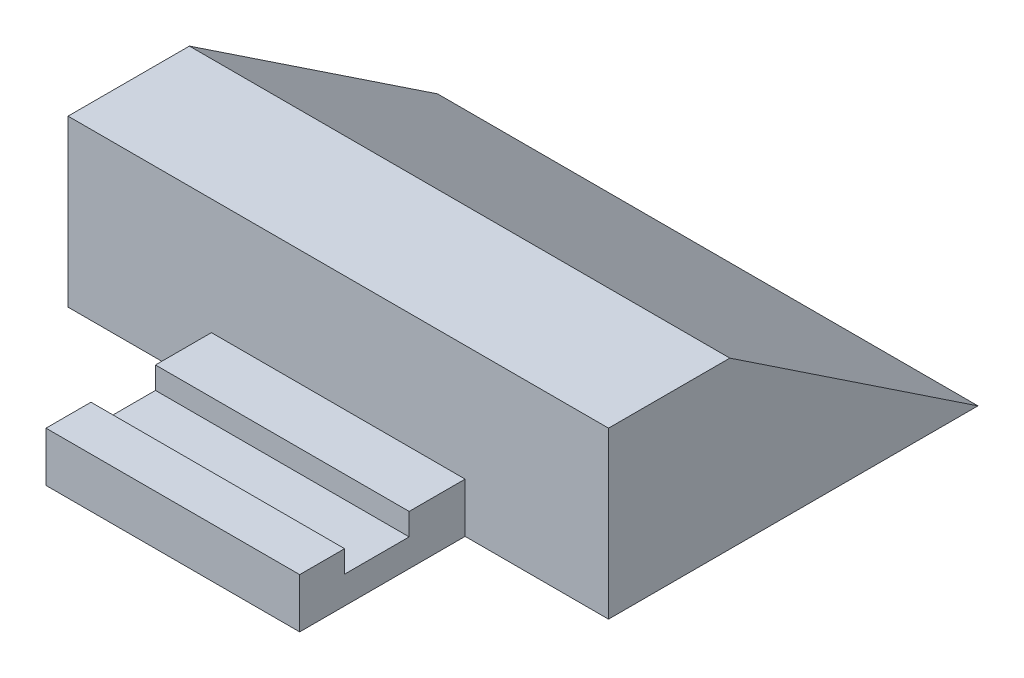
ISO-10303-21;
HEADER;
FILE_DESCRIPTION(('STEP AP214'),'2;1');
FILE_NAME('part.step','',(''),(''),'','','');
FILE_SCHEMA(('AUTOMOTIVE_DESIGN { 1 0 10303 214 1 1 1 1 }'));
ENDSEC;
DATA;
#1=APPLICATION_CONTEXT('core data for automotive mechanical design processes');
#2=APPLICATION_PROTOCOL_DEFINITION('international standard','automotive_design',2000,#1);
#3=PRODUCT_CONTEXT('',#1,'mechanical');
#4=PRODUCT('Part','Part','',(#3));
#5=PRODUCT_RELATED_PRODUCT_CATEGORY('part','',(#4));
#6=PRODUCT_DEFINITION_FORMATION('','',#4);
#7=PRODUCT_DEFINITION_CONTEXT('part definition',#1,'design');
#8=PRODUCT_DEFINITION('design','',#6,#7);
#9=PRODUCT_DEFINITION_SHAPE('','',#8);
#10=(LENGTH_UNIT() NAMED_UNIT(*) SI_UNIT(.MILLI.,.METRE.));
#11=(NAMED_UNIT(*) PLANE_ANGLE_UNIT() SI_UNIT($,.RADIAN.));
#12=(NAMED_UNIT(*) SI_UNIT($,.STERADIAN.) SOLID_ANGLE_UNIT());
#13=UNCERTAINTY_MEASURE_WITH_UNIT(LENGTH_MEASURE(1.E-05),#10,'distance_accuracy_value','');
#14=(GEOMETRIC_REPRESENTATION_CONTEXT(3) GLOBAL_UNCERTAINTY_ASSIGNED_CONTEXT((#13)) GLOBAL_UNIT_ASSIGNED_CONTEXT((#10,
#11,#12)) REPRESENTATION_CONTEXT('',''));
#15=CARTESIAN_POINT('',(0.,0.,0.));
#16=DIRECTION('',(0.,0.,1.));
#17=DIRECTION('',(1.,0.,0.));
#18=AXIS2_PLACEMENT_3D('',#15,#16,#17);
#19=CARTESIAN_POINT('',(49.,30.,-100.));
#20=DIRECTION('',(-1.,0.,0.));
#21=DIRECTION('',(0.,0.,1.));
#22=AXIS2_PLACEMENT_3D('',#19,#20,#21);
#23=PLANE('',#22);
#24=DIRECTION('',(0.,0.,-1.));
#25=VECTOR('',#24,1.);
#26=CARTESIAN_POINT('',(49.,0.,-100.));
#27=LINE('',#26,#25);
#28=CARTESIAN_POINT('',(49.,0.,-32.));
#29=VERTEX_POINT('',#28);
#30=CARTESIAN_POINT('',(49.,0.,-99.));
#31=VERTEX_POINT('',#30);
#32=EDGE_CURVE('E168',#29,#31,#27,.T.);
#33=ORIENTED_EDGE('',*,*,#32,.T.);
#34=DIRECTION('',(0.,-0.554700196225229,-0.832050294337844));
#35=VECTOR('',#34,1.);
#36=CARTESIAN_POINT('',(49.,0.,-99.));
#37=LINE('',#36,#35);
#38=CARTESIAN_POINT('',(49.,30.,-54.));
#39=VERTEX_POINT('',#38);
#40=EDGE_CURVE('E171',#39,#31,#37,.T.);
#41=ORIENTED_EDGE('',*,*,#40,.F.);
#42=DIRECTION('',(0.,0.,-1.));
#43=VECTOR('',#42,1.);
#44=CARTESIAN_POINT('',(49.,30.,-100.));
#45=LINE('',#44,#43);
#46=CARTESIAN_POINT('',(49.,30.,-32.));
#47=VERTEX_POINT('',#46);
#48=EDGE_CURVE('E156',#47,#39,#45,.T.);
#49=ORIENTED_EDGE('',*,*,#48,.F.);
#50=DIRECTION('',(0.,-1.,0.));
#51=VECTOR('',#50,1.);
#52=CARTESIAN_POINT('',(49.,30.,-32.));
#53=LINE('',#52,#51);
#54=EDGE_CURVE('E150',#47,#29,#53,.T.);
#55=ORIENTED_EDGE('',*,*,#54,.T.);
#56=EDGE_LOOP('',(#33,#41,#49,#55));
#57=FACE_BOUND('',#56,.T.);
#58=ADVANCED_FACE('F33',(#57),#23,.F.);
#59=CARTESIAN_POINT('',(-49.,30.,-100.));
#60=DIRECTION('',(1.,0.,0.));
#61=DIRECTION('',(0.,0.,-1.));
#62=AXIS2_PLACEMENT_3D('',#59,#60,#61);
#63=PLANE('',#62);
#64=DIRECTION('',(0.,0.,1.));
#65=VECTOR('',#64,1.);
#66=CARTESIAN_POINT('',(-49.,30.,-100.));
#67=LINE('',#66,#65);
#68=CARTESIAN_POINT('',(-49.,30.,-54.));
#69=VERTEX_POINT('',#68);
#70=CARTESIAN_POINT('',(-49.,30.,-32.));
#71=VERTEX_POINT('',#70);
#72=EDGE_CURVE('E173',#69,#71,#67,.T.);
#73=ORIENTED_EDGE('',*,*,#72,.F.);
#74=DIRECTION('',(0.,0.554700196225229,0.832050294337844));
#75=VECTOR('',#74,1.);
#76=CARTESIAN_POINT('',(-49.,0.,-99.));
#77=LINE('',#76,#75);
#78=CARTESIAN_POINT('',(-49.,0.,-99.));
#79=VERTEX_POINT('',#78);
#80=EDGE_CURVE('E181',#79,#69,#77,.T.);
#81=ORIENTED_EDGE('',*,*,#80,.F.);
#82=DIRECTION('',(0.,0.,1.));
#83=VECTOR('',#82,1.);
#84=CARTESIAN_POINT('',(-49.,0.,-100.));
#85=LINE('',#84,#83);
#86=CARTESIAN_POINT('',(-49.,0.,-32.));
#87=VERTEX_POINT('',#86);
#88=EDGE_CURVE('E166',#79,#87,#85,.T.);
#89=ORIENTED_EDGE('',*,*,#88,.T.);
#90=DIRECTION('',(0.,-1.,0.));
#91=VECTOR('',#90,1.);
#92=CARTESIAN_POINT('',(-49.,30.,-32.));
#93=LINE('',#92,#91);
#94=EDGE_CURVE('E40',#71,#87,#93,.T.);
#95=ORIENTED_EDGE('',*,*,#94,.F.);
#96=EDGE_LOOP('',(#73,#81,#89,#95));
#97=FACE_BOUND('',#96,.T.);
#98=ADVANCED_FACE('F245',(#97),#63,.F.);
#99=CARTESIAN_POINT('',(-23.,30.,-32.));
#100=DIRECTION('',(1.,0.,0.));
#101=DIRECTION('',(0.,0.,-1.));
#102=AXIS2_PLACEMENT_3D('',#99,#100,#101);
#103=PLANE('',#102);
#104=DIRECTION('',(0.,-1.,0.));
#105=VECTOR('',#104,1.);
#106=CARTESIAN_POINT('',(-23.,30.,-2.));
#107=LINE('',#106,#105);
#108=CARTESIAN_POINT('',(-23.,9.,-2.));
#109=VERTEX_POINT('',#108);
#110=CARTESIAN_POINT('',(-23.,0.,-2.));
#111=VERTEX_POINT('',#110);
#112=EDGE_CURVE('E142',#109,#111,#107,.T.);
#113=ORIENTED_EDGE('',*,*,#112,.F.);
#114=DIRECTION('',(0.,0.,1.));
#115=VECTOR('',#114,1.);
#116=CARTESIAN_POINT('',(-23.,9.,-32.));
#117=LINE('',#116,#115);
#118=CARTESIAN_POINT('',(-23.,9.,-10.15));
#119=VERTEX_POINT('',#118);
#120=EDGE_CURVE('E135',#119,#109,#117,.T.);
#121=ORIENTED_EDGE('',*,*,#120,.F.);
#122=DIRECTION('',(0.,1.,0.));
#123=VECTOR('',#122,1.);
#124=CARTESIAN_POINT('',(-23.,5.,-10.15));
#125=LINE('',#124,#123);
#126=CARTESIAN_POINT('',(-23.,5.,-10.15));
#127=VERTEX_POINT('',#126);
#128=EDGE_CURVE('E191',#127,#119,#125,.T.);
#129=ORIENTED_EDGE('',*,*,#128,.F.);
#130=DIRECTION('',(0.,0.,1.));
#131=VECTOR('',#130,1.);
#132=CARTESIAN_POINT('',(-23.,5.,-21.85));
#133=LINE('',#132,#131);
#134=CARTESIAN_POINT('',(-23.,5.,-21.85));
#135=VERTEX_POINT('',#134);
#136=EDGE_CURVE('E198',#135,#127,#133,.T.);
#137=ORIENTED_EDGE('',*,*,#136,.F.);
#138=DIRECTION('',(0.,1.,0.));
#139=VECTOR('',#138,1.);
#140=CARTESIAN_POINT('',(-23.,5.,-21.85));
#141=LINE('',#140,#139);
#142=CARTESIAN_POINT('',(-23.,9.,-21.85));
#143=VERTEX_POINT('',#142);
#144=EDGE_CURVE('E134',#135,#143,#141,.T.);
#145=ORIENTED_EDGE('',*,*,#144,.T.);
#146=CARTESIAN_POINT('',(-23.,9.,-32.));
#147=VERTEX_POINT('',#146);
#148=EDGE_CURVE('E55',#147,#143,#117,.T.);
#149=ORIENTED_EDGE('',*,*,#148,.F.);
#150=DIRECTION('',(0.,-1.,0.));
#151=VECTOR('',#150,1.);
#152=CARTESIAN_POINT('',(-23.,30.,-32.));
#153=LINE('',#152,#151);
#154=CARTESIAN_POINT('',(-23.,0.,-32.));
#155=VERTEX_POINT('',#154);
#156=EDGE_CURVE('E131',#147,#155,#153,.T.);
#157=ORIENTED_EDGE('',*,*,#156,.T.);
#158=DIRECTION('',(0.,0.,1.));
#159=VECTOR('',#158,1.);
#160=CARTESIAN_POINT('',(-23.,0.,-32.));
#161=LINE('',#160,#159);
#162=EDGE_CURVE('E163',#155,#111,#161,.T.);
#163=ORIENTED_EDGE('',*,*,#162,.T.);
#164=EDGE_LOOP('',(#113,#121,#129,#137,#145,#149,#157,#163));
#165=FACE_BOUND('',#164,.T.);
#166=ADVANCED_FACE('F129',(#165),#103,.F.);
#167=CARTESIAN_POINT('',(23.,30.,-2.));
#168=DIRECTION('',(0.,0.,-1.));
#169=DIRECTION('',(-1.,0.,0.));
#170=AXIS2_PLACEMENT_3D('',#167,#168,#169);
#171=PLANE('',#170);
#172=DIRECTION('',(0.,-1.,0.));
#173=VECTOR('',#172,1.);
#174=CARTESIAN_POINT('',(23.,30.,-2.));
#175=LINE('',#174,#173);
#176=CARTESIAN_POINT('',(23.,9.,-2.00000000000001));
#177=VERTEX_POINT('',#176);
#178=CARTESIAN_POINT('',(23.,0.,-2.));
#179=VERTEX_POINT('',#178);
#180=EDGE_CURVE('E144',#177,#179,#175,.T.);
#181=ORIENTED_EDGE('',*,*,#180,.F.);
#182=DIRECTION('',(-1.,0.,0.));
#183=VECTOR('',#182,1.);
#184=CARTESIAN_POINT('',(23.,9.,-2.));
#185=LINE('',#184,#183);
#186=EDGE_CURVE('E206',#177,#109,#185,.T.);
#187=ORIENTED_EDGE('',*,*,#186,.T.);
#188=ORIENTED_EDGE('',*,*,#112,.T.);
#189=DIRECTION('',(1.,0.,0.));
#190=VECTOR('',#189,1.);
#191=CARTESIAN_POINT('',(23.,0.,-2.));
#192=LINE('',#191,#190);
#193=EDGE_CURVE('E160',#111,#179,#192,.T.);
#194=ORIENTED_EDGE('',*,*,#193,.T.);
#195=EDGE_LOOP('',(#181,#187,#188,#194));
#196=FACE_BOUND('',#195,.T.);
#197=ADVANCED_FACE('F225',(#196),#171,.F.);
#198=CARTESIAN_POINT('',(23.,30.,-32.));
#199=DIRECTION('',(-1.,0.,0.));
#200=DIRECTION('',(0.,0.,1.));
#201=AXIS2_PLACEMENT_3D('',#198,#199,#200);
#202=PLANE('',#201);
#203=DIRECTION('',(0.,-1.,0.));
#204=VECTOR('',#203,1.);
#205=CARTESIAN_POINT('',(23.,30.,-32.));
#206=LINE('',#205,#204);
#207=CARTESIAN_POINT('',(23.,9.,-32.));
#208=VERTEX_POINT('',#207);
#209=CARTESIAN_POINT('',(23.,0.,-32.));
#210=VERTEX_POINT('',#209);
#211=EDGE_CURVE('E148',#208,#210,#206,.T.);
#212=ORIENTED_EDGE('',*,*,#211,.F.);
#213=DIRECTION('',(0.,0.,-1.));
#214=VECTOR('',#213,1.);
#215=CARTESIAN_POINT('',(23.,9.,-32.));
#216=LINE('',#215,#214);
#217=CARTESIAN_POINT('',(23.,9.,-21.85));
#218=VERTEX_POINT('',#217);
#219=EDGE_CURVE('E121',#218,#208,#216,.T.);
#220=ORIENTED_EDGE('',*,*,#219,.F.);
#221=DIRECTION('',(0.,1.,0.));
#222=VECTOR('',#221,1.);
#223=CARTESIAN_POINT('',(23.,5.,-21.85));
#224=LINE('',#223,#222);
#225=CARTESIAN_POINT('',(23.,5.,-21.85));
#226=VERTEX_POINT('',#225);
#227=EDGE_CURVE('E186',#226,#218,#224,.T.);
#228=ORIENTED_EDGE('',*,*,#227,.F.);
#229=DIRECTION('',(0.,0.,-1.));
#230=VECTOR('',#229,1.);
#231=CARTESIAN_POINT('',(23.,5.,-21.85));
#232=LINE('',#231,#230);
#233=CARTESIAN_POINT('',(23.,5.,-10.15));
#234=VERTEX_POINT('',#233);
#235=EDGE_CURVE('E203',#234,#226,#232,.T.);
#236=ORIENTED_EDGE('',*,*,#235,.F.);
#237=DIRECTION('',(0.,1.,0.));
#238=VECTOR('',#237,1.);
#239=CARTESIAN_POINT('',(23.,5.,-10.15));
#240=LINE('',#239,#238);
#241=CARTESIAN_POINT('',(23.,9.,-10.15));
#242=VERTEX_POINT('',#241);
#243=EDGE_CURVE('E185',#234,#242,#240,.T.);
#244=ORIENTED_EDGE('',*,*,#243,.T.);
#245=EDGE_CURVE('E47',#177,#242,#216,.T.);
#246=ORIENTED_EDGE('',*,*,#245,.F.);
#247=ORIENTED_EDGE('',*,*,#180,.T.);
#248=DIRECTION('',(0.,0.,-1.));
#249=VECTOR('',#248,1.);
#250=CARTESIAN_POINT('',(23.,0.,-32.));
#251=LINE('',#250,#249);
#252=EDGE_CURVE('E157',#179,#210,#251,.T.);
#253=ORIENTED_EDGE('',*,*,#252,.T.);
#254=EDGE_LOOP('',(#212,#220,#228,#236,#244,#246,#247,#253));
#255=FACE_BOUND('',#254,.T.);
#256=ADVANCED_FACE('F218',(#255),#202,.F.);
#257=CARTESIAN_POINT('',(49.,30.,-32.));
#258=DIRECTION('',(0.,0.,-1.));
#259=DIRECTION('',(-1.,0.,0.));
#260=AXIS2_PLACEMENT_3D('',#257,#258,#259);
#261=PLANE('',#260);
#262=DIRECTION('',(1.,0.,0.));
#263=VECTOR('',#262,1.);
#264=CARTESIAN_POINT('',(49.,0.,-32.));
#265=LINE('',#264,#263);
#266=EDGE_CURVE('E154',#210,#29,#265,.T.);
#267=ORIENTED_EDGE('',*,*,#266,.T.);
#268=ORIENTED_EDGE('',*,*,#54,.F.);
#269=DIRECTION('',(1.,0.,0.));
#270=VECTOR('',#269,1.);
#271=CARTESIAN_POINT('',(-49.,30.,-32.));
#272=LINE('',#271,#270);
#273=EDGE_CURVE('E153',#71,#47,#272,.T.);
#274=ORIENTED_EDGE('',*,*,#273,.F.);
#275=ORIENTED_EDGE('',*,*,#94,.T.);
#276=DIRECTION('',(1.,0.,0.));
#277=VECTOR('',#276,1.);
#278=CARTESIAN_POINT('',(-49.,0.,-32.));
#279=LINE('',#278,#277);
#280=EDGE_CURVE('E140',#87,#155,#279,.T.);
#281=ORIENTED_EDGE('',*,*,#280,.T.);
#282=ORIENTED_EDGE('',*,*,#156,.F.);
#283=DIRECTION('',(-1.,0.,0.));
#284=VECTOR('',#283,1.);
#285=CARTESIAN_POINT('',(63.2751921731186,9.,-32.));
#286=LINE('',#285,#284);
#287=EDGE_CURVE('E118',#208,#147,#286,.T.);
#288=ORIENTED_EDGE('',*,*,#287,.F.);
#289=ORIENTED_EDGE('',*,*,#211,.T.);
#290=EDGE_LOOP('',(#267,#268,#274,#275,#281,#282,#288,#289));
#291=FACE_BOUND('',#290,.T.);
#292=ADVANCED_FACE('F137',(#291),#261,.F.);
#293=CARTESIAN_POINT('',(0.,30.,0.));
#294=DIRECTION('',(0.,-1.,0.));
#295=DIRECTION('',(0.,0.,-1.));
#296=AXIS2_PLACEMENT_3D('',#293,#294,#295);
#297=PLANE('',#296);
#298=ORIENTED_EDGE('',*,*,#273,.T.);
#299=ORIENTED_EDGE('',*,*,#48,.T.);
#300=DIRECTION('',(-1.,0.,0.));
#301=VECTOR('',#300,1.);
#302=CARTESIAN_POINT('',(123.346958013474,30.,-54.));
#303=LINE('',#302,#301);
#304=EDGE_CURVE('E178',#39,#69,#303,.T.);
#305=ORIENTED_EDGE('',*,*,#304,.T.);
#306=ORIENTED_EDGE('',*,*,#72,.T.);
#307=EDGE_LOOP('',(#298,#299,#305,#306));
#308=FACE_BOUND('',#307,.T.);
#309=ADVANCED_FACE('F239',(#308),#297,.F.);
#310=CARTESIAN_POINT('',(0.,0.,0.));
#311=DIRECTION('',(0.,-1.,0.));
#312=DIRECTION('',(0.,0.,-1.));
#313=AXIS2_PLACEMENT_3D('',#310,#311,#312);
#314=PLANE('',#313);
#315=DIRECTION('',(-1.,0.,0.));
#316=VECTOR('',#315,1.);
#317=CARTESIAN_POINT('',(123.346958013474,0.,-99.));
#318=LINE('',#317,#316);
#319=EDGE_CURVE('E179',#31,#79,#318,.T.);
#320=ORIENTED_EDGE('',*,*,#319,.F.);
#321=ORIENTED_EDGE('',*,*,#32,.F.);
#322=ORIENTED_EDGE('',*,*,#266,.F.);
#323=ORIENTED_EDGE('',*,*,#252,.F.);
#324=ORIENTED_EDGE('',*,*,#193,.F.);
#325=ORIENTED_EDGE('',*,*,#162,.F.);
#326=ORIENTED_EDGE('',*,*,#280,.F.);
#327=ORIENTED_EDGE('',*,*,#88,.F.);
#328=EDGE_LOOP('',(#320,#321,#322,#323,#324,#325,#326,#327));
#329=FACE_BOUND('',#328,.T.);
#330=ADVANCED_FACE('F232',(#329),#314,.T.);
#331=CARTESIAN_POINT('',(123.346958013474,0.,-99.));
#332=DIRECTION('',(0.,-0.832050294337844,0.554700196225229));
#333=DIRECTION('',(0.,-0.554700196225229,-0.832050294337844));
#334=AXIS2_PLACEMENT_3D('',#331,#332,#333);
#335=PLANE('',#334);
#336=ORIENTED_EDGE('',*,*,#40,.T.);
#337=ORIENTED_EDGE('',*,*,#319,.T.);
#338=ORIENTED_EDGE('',*,*,#80,.T.);
#339=ORIENTED_EDGE('',*,*,#304,.F.);
#340=EDGE_LOOP('',(#336,#337,#338,#339));
#341=FACE_BOUND('',#340,.T.);
#342=ADVANCED_FACE('F247',(#341),#335,.F.);
#343=CARTESIAN_POINT('',(23.,5.,-10.15));
#344=DIRECTION('',(0.,0.,1.));
#345=DIRECTION('',(1.,0.,0.));
#346=AXIS2_PLACEMENT_3D('',#343,#344,#345);
#347=PLANE('',#346);
#348=ORIENTED_EDGE('',*,*,#128,.T.);
#349=DIRECTION('',(1.,0.,0.));
#350=VECTOR('',#349,1.);
#351=CARTESIAN_POINT('',(23.,9.,-10.15));
#352=LINE('',#351,#350);
#353=EDGE_CURVE('E209',#119,#242,#352,.T.);
#354=ORIENTED_EDGE('',*,*,#353,.T.);
#355=ORIENTED_EDGE('',*,*,#243,.F.);
#356=DIRECTION('',(1.,0.,0.));
#357=VECTOR('',#356,1.);
#358=CARTESIAN_POINT('',(23.,5.,-10.15));
#359=LINE('',#358,#357);
#360=EDGE_CURVE('E189',#127,#234,#359,.T.);
#361=ORIENTED_EDGE('',*,*,#360,.F.);
#362=EDGE_LOOP('',(#348,#354,#355,#361));
#363=FACE_BOUND('',#362,.T.);
#364=ADVANCED_FACE('F212',(#363),#347,.F.);
#365=CARTESIAN_POINT('',(23.,5.,-21.85));
#366=DIRECTION('',(0.,0.,-1.));
#367=DIRECTION('',(-1.,0.,0.));
#368=AXIS2_PLACEMENT_3D('',#365,#366,#367);
#369=PLANE('',#368);
#370=ORIENTED_EDGE('',*,*,#227,.T.);
#371=DIRECTION('',(-1.,0.,0.));
#372=VECTOR('',#371,1.);
#373=CARTESIAN_POINT('',(23.,9.,-21.85));
#374=LINE('',#373,#372);
#375=EDGE_CURVE('E11',#218,#143,#374,.T.);
#376=ORIENTED_EDGE('',*,*,#375,.T.);
#377=ORIENTED_EDGE('',*,*,#144,.F.);
#378=DIRECTION('',(-1.,0.,0.));
#379=VECTOR('',#378,1.);
#380=CARTESIAN_POINT('',(23.,5.,-21.85));
#381=LINE('',#380,#379);
#382=EDGE_CURVE('E200',#226,#135,#381,.T.);
#383=ORIENTED_EDGE('',*,*,#382,.F.);
#384=EDGE_LOOP('',(#370,#376,#377,#383));
#385=FACE_BOUND('',#384,.T.);
#386=ADVANCED_FACE('F254',(#385),#369,.F.);
#387=CARTESIAN_POINT('',(0.,5.,0.));
#388=DIRECTION('',(0.,-1.,0.));
#389=DIRECTION('',(0.,0.,-1.));
#390=AXIS2_PLACEMENT_3D('',#387,#388,#389);
#391=PLANE('',#390);
#392=ORIENTED_EDGE('',*,*,#235,.T.);
#393=ORIENTED_EDGE('',*,*,#382,.T.);
#394=ORIENTED_EDGE('',*,*,#136,.T.);
#395=ORIENTED_EDGE('',*,*,#360,.T.);
#396=EDGE_LOOP('',(#392,#393,#394,#395));
#397=FACE_BOUND('',#396,.T.);
#398=ADVANCED_FACE('F222',(#397),#391,.F.);
#399=CARTESIAN_POINT('',(63.2751921731186,9.,-32.));
#400=DIRECTION('',(0.,-1.,0.));
#401=DIRECTION('',(0.,0.,-1.));
#402=AXIS2_PLACEMENT_3D('',#399,#400,#401);
#403=PLANE('',#402);
#404=ORIENTED_EDGE('',*,*,#219,.T.);
#405=ORIENTED_EDGE('',*,*,#287,.T.);
#406=ORIENTED_EDGE('',*,*,#148,.T.);
#407=ORIENTED_EDGE('',*,*,#375,.F.);
#408=EDGE_LOOP('',(#404,#405,#406,#407));
#409=FACE_BOUND('',#408,.T.);
#410=ADVANCED_FACE('F119',(#409),#403,.F.);
#411=ORIENTED_EDGE('',*,*,#245,.T.);
#412=ORIENTED_EDGE('',*,*,#353,.F.);
#413=ORIENTED_EDGE('',*,*,#120,.T.);
#414=ORIENTED_EDGE('',*,*,#186,.F.);
#415=EDGE_LOOP('',(#411,#412,#413,#414));
#416=FACE_BOUND('',#415,.T.);
#417=ADVANCED_FACE('F223',(#416),#403,.F.);
#418=CLOSED_SHELL('',(#58,#98,#166,#197,#256,#292,#309,#330,#342,#364,#386,#398,#410,#417));
#419=MANIFOLD_SOLID_BREP('B2',#418);
#420=ADVANCED_BREP_SHAPE_REPRESENTATION('',(#18,#419),#14);
#421=SHAPE_DEFINITION_REPRESENTATION(#9,#420);
ENDSEC;
END-ISO-10303-21;
